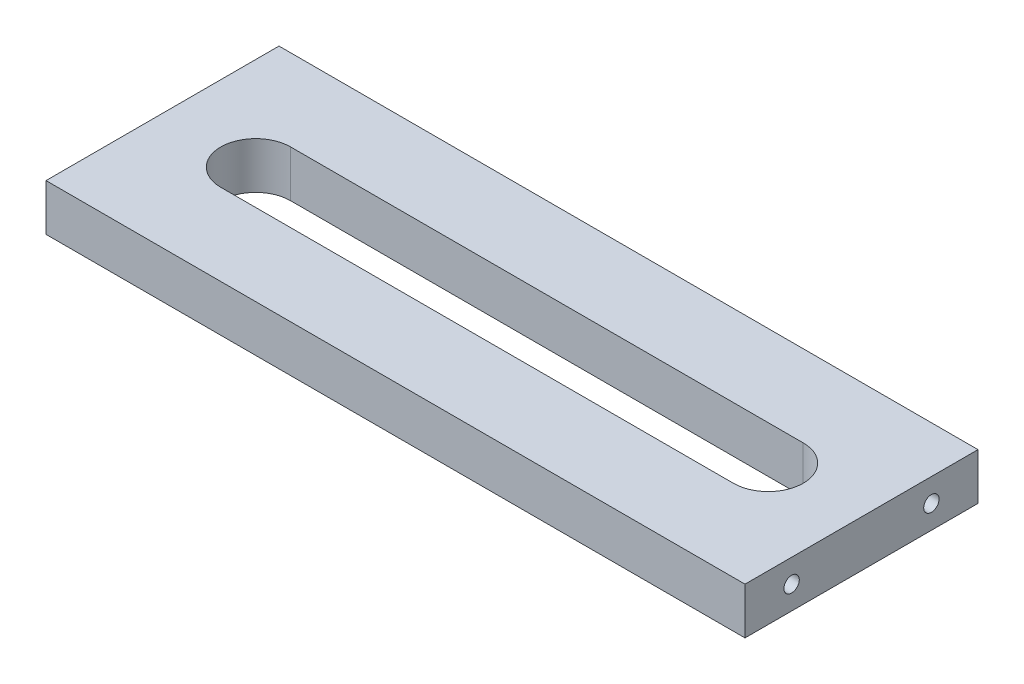
ISO-10303-21;
HEADER;
FILE_DESCRIPTION(('STEP AP214'),'2;1');
FILE_NAME('part.step','',(''),(''),'','','');
FILE_SCHEMA(('AUTOMOTIVE_DESIGN { 1 0 10303 214 1 1 1 1 }'));
ENDSEC;
DATA;
#1=APPLICATION_CONTEXT('core data for automotive mechanical design processes');
#2=APPLICATION_PROTOCOL_DEFINITION('international standard','automotive_design',2000,#1);
#3=PRODUCT_CONTEXT('',#1,'mechanical');
#4=PRODUCT('Part','Part','',(#3));
#5=PRODUCT_RELATED_PRODUCT_CATEGORY('part','',(#4));
#6=PRODUCT_DEFINITION_FORMATION('','',#4);
#7=PRODUCT_DEFINITION_CONTEXT('part definition',#1,'design');
#8=PRODUCT_DEFINITION('design','',#6,#7);
#9=PRODUCT_DEFINITION_SHAPE('','',#8);
#10=(LENGTH_UNIT() NAMED_UNIT(*) SI_UNIT(.MILLI.,.METRE.));
#11=(NAMED_UNIT(*) PLANE_ANGLE_UNIT() SI_UNIT($,.RADIAN.));
#12=(NAMED_UNIT(*) SI_UNIT($,.STERADIAN.) SOLID_ANGLE_UNIT());
#13=UNCERTAINTY_MEASURE_WITH_UNIT(LENGTH_MEASURE(1.E-05),#10,'distance_accuracy_value','');
#14=(GEOMETRIC_REPRESENTATION_CONTEXT(3) GLOBAL_UNCERTAINTY_ASSIGNED_CONTEXT((#13)) GLOBAL_UNIT_ASSIGNED_CONTEXT((#10,
#11,#12)) REPRESENTATION_CONTEXT('',''));
#15=CARTESIAN_POINT('',(0.,0.,0.));
#16=DIRECTION('',(0.,0.,1.));
#17=DIRECTION('',(1.,0.,0.));
#18=AXIS2_PLACEMENT_3D('',#15,#16,#17);
#19=CARTESIAN_POINT('',(75.,10.,25.));
#20=DIRECTION('',(-1.,0.,0.));
#21=DIRECTION('',(0.,0.,1.));
#22=AXIS2_PLACEMENT_3D('',#19,#20,#21);
#23=PLANE('',#22);
#24=CARTESIAN_POINT('',(75.,5.,15.));
#25=DIRECTION('',(1.,0.,0.));
#26=DIRECTION('',(0.,0.,-1.));
#27=AXIS2_PLACEMENT_3D('',#24,#25,#26);
#28=CIRCLE('',#27,1.64999999999999);
#29=CARTESIAN_POINT('',(75.,5.,13.35));
#30=VERTEX_POINT('',#29);
#31=EDGE_CURVE('E118',#30,#30,#28,.T.);
#32=ORIENTED_EDGE('',*,*,#31,.F.);
#33=EDGE_LOOP('',(#32));
#34=FACE_BOUND('',#33,.T.);
#35=CARTESIAN_POINT('',(75.,5.,-15.));
#36=DIRECTION('',(1.,0.,0.));
#37=DIRECTION('',(0.,0.,-1.));
#38=AXIS2_PLACEMENT_3D('',#35,#36,#37);
#39=CIRCLE('',#38,1.64999999999999);
#40=CARTESIAN_POINT('',(75.,5.,-16.65));
#41=VERTEX_POINT('',#40);
#42=EDGE_CURVE('E117',#41,#41,#39,.T.);
#43=ORIENTED_EDGE('',*,*,#42,.F.);
#44=EDGE_LOOP('',(#43));
#45=FACE_BOUND('',#44,.T.);
#46=DIRECTION('',(0.,0.,-1.));
#47=VECTOR('',#46,1.);
#48=CARTESIAN_POINT('',(75.,0.,25.));
#49=LINE('',#48,#47);
#50=CARTESIAN_POINT('',(75.,0.,25.));
#51=VERTEX_POINT('',#50);
#52=CARTESIAN_POINT('',(75.,0.,-25.));
#53=VERTEX_POINT('',#52);
#54=EDGE_CURVE('E163',#51,#53,#49,.T.);
#55=ORIENTED_EDGE('',*,*,#54,.T.);
#56=DIRECTION('',(0.,-1.,0.));
#57=VECTOR('',#56,1.);
#58=CARTESIAN_POINT('',(75.,10.,-25.));
#59=LINE('',#58,#57);
#60=CARTESIAN_POINT('',(75.,10.,-25.));
#61=VERTEX_POINT('',#60);
#62=EDGE_CURVE('E11',#61,#53,#59,.T.);
#63=ORIENTED_EDGE('',*,*,#62,.F.);
#64=DIRECTION('',(0.,0.,-1.));
#65=VECTOR('',#64,1.);
#66=CARTESIAN_POINT('',(75.,10.,25.));
#67=LINE('',#66,#65);
#68=CARTESIAN_POINT('',(75.,10.,25.));
#69=VERTEX_POINT('',#68);
#70=EDGE_CURVE('E169',#69,#61,#67,.T.);
#71=ORIENTED_EDGE('',*,*,#70,.F.);
#72=DIRECTION('',(0.,-1.,0.));
#73=VECTOR('',#72,1.);
#74=CARTESIAN_POINT('',(75.,10.,25.));
#75=LINE('',#74,#73);
#76=EDGE_CURVE('E179',#69,#51,#75,.T.);
#77=ORIENTED_EDGE('',*,*,#76,.T.);
#78=EDGE_LOOP('',(#55,#63,#71,#77));
#79=FACE_BOUND('',#78,.T.);
#80=ADVANCED_FACE('F33',(#34,#45,#79),#23,.F.);
#81=CARTESIAN_POINT('',(-75.,10.,-25.));
#82=DIRECTION('',(0.,0.,1.));
#83=DIRECTION('',(1.,0.,0.));
#84=AXIS2_PLACEMENT_3D('',#81,#82,#83);
#85=PLANE('',#84);
#86=DIRECTION('',(-1.,0.,0.));
#87=VECTOR('',#86,1.);
#88=CARTESIAN_POINT('',(-75.,0.,-25.));
#89=LINE('',#88,#87);
#90=CARTESIAN_POINT('',(-75.,0.,-25.));
#91=VERTEX_POINT('',#90);
#92=EDGE_CURVE('E182',#53,#91,#89,.T.);
#93=ORIENTED_EDGE('',*,*,#92,.T.);
#94=DIRECTION('',(0.,-1.,0.));
#95=VECTOR('',#94,1.);
#96=CARTESIAN_POINT('',(-75.,10.,-25.));
#97=LINE('',#96,#95);
#98=CARTESIAN_POINT('',(-75.,10.,-25.));
#99=VERTEX_POINT('',#98);
#100=EDGE_CURVE('E40',#99,#91,#97,.T.);
#101=ORIENTED_EDGE('',*,*,#100,.F.);
#102=DIRECTION('',(-1.,0.,0.));
#103=VECTOR('',#102,1.);
#104=CARTESIAN_POINT('',(-75.,10.,-25.));
#105=LINE('',#104,#103);
#106=EDGE_CURVE('E172',#61,#99,#105,.T.);
#107=ORIENTED_EDGE('',*,*,#106,.F.);
#108=ORIENTED_EDGE('',*,*,#62,.T.);
#109=EDGE_LOOP('',(#93,#101,#107,#108));
#110=FACE_BOUND('',#109,.T.);
#111=ADVANCED_FACE('F212',(#110),#85,.F.);
#112=CARTESIAN_POINT('',(-75.,10.,25.));
#113=DIRECTION('',(1.,0.,0.));
#114=DIRECTION('',(0.,0.,-1.));
#115=AXIS2_PLACEMENT_3D('',#112,#113,#114);
#116=PLANE('',#115);
#117=CARTESIAN_POINT('',(-75.,5.,-15.));
#118=DIRECTION('',(-1.,0.,0.));
#119=DIRECTION('',(0.,0.,1.));
#120=AXIS2_PLACEMENT_3D('',#117,#118,#119);
#121=CIRCLE('',#120,1.64999999999999);
#122=CARTESIAN_POINT('',(-75.,5.,-13.35));
#123=VERTEX_POINT('',#122);
#124=EDGE_CURVE('E128',#123,#123,#121,.T.);
#125=ORIENTED_EDGE('',*,*,#124,.F.);
#126=EDGE_LOOP('',(#125));
#127=FACE_BOUND('',#126,.T.);
#128=CARTESIAN_POINT('',(-75.,5.,15.));
#129=DIRECTION('',(-1.,0.,0.));
#130=DIRECTION('',(0.,0.,1.));
#131=AXIS2_PLACEMENT_3D('',#128,#129,#130);
#132=CIRCLE('',#131,1.64999999999999);
#133=CARTESIAN_POINT('',(-75.,5.,16.65));
#134=VERTEX_POINT('',#133);
#135=EDGE_CURVE('E134',#134,#134,#132,.T.);
#136=ORIENTED_EDGE('',*,*,#135,.F.);
#137=EDGE_LOOP('',(#136));
#138=FACE_BOUND('',#137,.T.);
#139=DIRECTION('',(0.,0.,1.));
#140=VECTOR('',#139,1.);
#141=CARTESIAN_POINT('',(-75.,0.,25.));
#142=LINE('',#141,#140);
#143=CARTESIAN_POINT('',(-75.,0.,25.));
#144=VERTEX_POINT('',#143);
#145=EDGE_CURVE('E184',#91,#144,#142,.T.);
#146=ORIENTED_EDGE('',*,*,#145,.T.);
#147=DIRECTION('',(0.,-1.,0.));
#148=VECTOR('',#147,1.);
#149=CARTESIAN_POINT('',(-75.,10.,25.));
#150=LINE('',#149,#148);
#151=CARTESIAN_POINT('',(-75.,10.,25.));
#152=VERTEX_POINT('',#151);
#153=EDGE_CURVE('E189',#152,#144,#150,.T.);
#154=ORIENTED_EDGE('',*,*,#153,.F.);
#155=DIRECTION('',(0.,0.,1.));
#156=VECTOR('',#155,1.);
#157=CARTESIAN_POINT('',(-75.,10.,25.));
#158=LINE('',#157,#156);
#159=EDGE_CURVE('E175',#99,#152,#158,.T.);
#160=ORIENTED_EDGE('',*,*,#159,.F.);
#161=ORIENTED_EDGE('',*,*,#100,.T.);
#162=EDGE_LOOP('',(#146,#154,#160,#161));
#163=FACE_BOUND('',#162,.T.);
#164=ADVANCED_FACE('F196',(#127,#138,#163),#116,.F.);
#165=CARTESIAN_POINT('',(-75.,10.,25.));
#166=DIRECTION('',(0.,0.,-1.));
#167=DIRECTION('',(-1.,0.,0.));
#168=AXIS2_PLACEMENT_3D('',#165,#166,#167);
#169=PLANE('',#168);
#170=DIRECTION('',(1.,0.,0.));
#171=VECTOR('',#170,1.);
#172=CARTESIAN_POINT('',(-75.,0.,25.));
#173=LINE('',#172,#171);
#174=EDGE_CURVE('E173',#144,#51,#173,.T.);
#175=ORIENTED_EDGE('',*,*,#174,.T.);
#176=ORIENTED_EDGE('',*,*,#76,.F.);
#177=DIRECTION('',(1.,0.,0.));
#178=VECTOR('',#177,1.);
#179=CARTESIAN_POINT('',(-75.,10.,25.));
#180=LINE('',#179,#178);
#181=EDGE_CURVE('E177',#152,#69,#180,.T.);
#182=ORIENTED_EDGE('',*,*,#181,.F.);
#183=ORIENTED_EDGE('',*,*,#153,.T.);
#184=EDGE_LOOP('',(#175,#176,#182,#183));
#185=FACE_BOUND('',#184,.T.);
#186=ADVANCED_FACE('F205',(#185),#169,.F.);
#187=CARTESIAN_POINT('',(0.,10.,0.));
#188=DIRECTION('',(0.,-1.,0.));
#189=DIRECTION('',(0.,0.,-1.));
#190=AXIS2_PLACEMENT_3D('',#187,#188,#189);
#191=PLANE('',#190);
#192=DIRECTION('',(1.,0.,0.));
#193=VECTOR('',#192,1.);
#194=CARTESIAN_POINT('',(-55.,10.,7.5));
#195=LINE('',#194,#193);
#196=CARTESIAN_POINT('',(-55.,10.,7.5));
#197=VERTEX_POINT('',#196);
#198=CARTESIAN_POINT('',(55.,10.,7.5));
#199=VERTEX_POINT('',#198);
#200=EDGE_CURVE('E153',#197,#199,#195,.T.);
#201=ORIENTED_EDGE('',*,*,#200,.F.);
#202=CARTESIAN_POINT('',(-55.,10.,0.));
#203=DIRECTION('',(0.,1.,0.));
#204=DIRECTION('',(0.,0.,1.));
#205=AXIS2_PLACEMENT_3D('',#202,#203,#204);
#206=CIRCLE('',#205,7.5);
#207=CARTESIAN_POINT('',(-55.,10.,-7.5));
#208=VERTEX_POINT('',#207);
#209=EDGE_CURVE('E47',#208,#197,#206,.T.);
#210=ORIENTED_EDGE('',*,*,#209,.F.);
#211=DIRECTION('',(-1.,0.,0.));
#212=VECTOR('',#211,1.);
#213=CARTESIAN_POINT('',(-55.,10.,-7.5));
#214=LINE('',#213,#212);
#215=CARTESIAN_POINT('',(55.,10.,-7.5));
#216=VERTEX_POINT('',#215);
#217=EDGE_CURVE('E144',#216,#208,#214,.T.);
#218=ORIENTED_EDGE('',*,*,#217,.F.);
#219=CARTESIAN_POINT('',(55.,10.,0.));
#220=DIRECTION('',(0.,1.,0.));
#221=DIRECTION('',(0.,0.,1.));
#222=AXIS2_PLACEMENT_3D('',#219,#220,#221);
#223=CIRCLE('',#222,7.5);
#224=EDGE_CURVE('E156',#199,#216,#223,.T.);
#225=ORIENTED_EDGE('',*,*,#224,.F.);
#226=EDGE_LOOP('',(#201,#210,#218,#225));
#227=FACE_BOUND('',#226,.T.);
#228=ORIENTED_EDGE('',*,*,#70,.T.);
#229=ORIENTED_EDGE('',*,*,#106,.T.);
#230=ORIENTED_EDGE('',*,*,#159,.T.);
#231=ORIENTED_EDGE('',*,*,#181,.T.);
#232=EDGE_LOOP('',(#228,#229,#230,#231));
#233=FACE_BOUND('',#232,.T.);
#234=ADVANCED_FACE('F211',(#227,#233),#191,.F.);
#235=CARTESIAN_POINT('',(0.,0.,0.));
#236=DIRECTION('',(0.,-1.,0.));
#237=DIRECTION('',(0.,0.,-1.));
#238=AXIS2_PLACEMENT_3D('',#235,#236,#237);
#239=PLANE('',#238);
#240=CARTESIAN_POINT('',(-55.,0.,0.));
#241=DIRECTION('',(0.,1.,0.));
#242=DIRECTION('',(0.,0.,1.));
#243=AXIS2_PLACEMENT_3D('',#240,#241,#242);
#244=CIRCLE('',#243,7.5);
#245=CARTESIAN_POINT('',(-55.,0.,-7.5));
#246=VERTEX_POINT('',#245);
#247=CARTESIAN_POINT('',(-55.,0.,7.5));
#248=VERTEX_POINT('',#247);
#249=EDGE_CURVE('E140',#246,#248,#244,.T.);
#250=ORIENTED_EDGE('',*,*,#249,.T.);
#251=DIRECTION('',(1.,0.,0.));
#252=VECTOR('',#251,1.);
#253=CARTESIAN_POINT('',(-55.,0.,7.5));
#254=LINE('',#253,#252);
#255=CARTESIAN_POINT('',(55.,0.,7.5));
#256=VERTEX_POINT('',#255);
#257=EDGE_CURVE('E143',#248,#256,#254,.T.);
#258=ORIENTED_EDGE('',*,*,#257,.T.);
#259=CARTESIAN_POINT('',(55.,0.,0.));
#260=DIRECTION('',(0.,1.,0.));
#261=DIRECTION('',(0.,0.,1.));
#262=AXIS2_PLACEMENT_3D('',#259,#260,#261);
#263=CIRCLE('',#262,7.5);
#264=CARTESIAN_POINT('',(55.,0.,-7.5));
#265=VERTEX_POINT('',#264);
#266=EDGE_CURVE('E55',#256,#265,#263,.T.);
#267=ORIENTED_EDGE('',*,*,#266,.T.);
#268=DIRECTION('',(-1.,0.,0.));
#269=VECTOR('',#268,1.);
#270=CARTESIAN_POINT('',(-55.,0.,-7.5));
#271=LINE('',#270,#269);
#272=EDGE_CURVE('E148',#265,#246,#271,.T.);
#273=ORIENTED_EDGE('',*,*,#272,.T.);
#274=EDGE_LOOP('',(#250,#258,#267,#273));
#275=FACE_BOUND('',#274,.T.);
#276=ORIENTED_EDGE('',*,*,#54,.F.);
#277=ORIENTED_EDGE('',*,*,#174,.F.);
#278=ORIENTED_EDGE('',*,*,#145,.F.);
#279=ORIENTED_EDGE('',*,*,#92,.F.);
#280=EDGE_LOOP('',(#276,#277,#278,#279));
#281=FACE_BOUND('',#280,.T.);
#282=ADVANCED_FACE('F202',(#275,#281),#239,.T.);
#283=CARTESIAN_POINT('',(-55.,0.,0.));
#284=DIRECTION('',(0.,1.,0.));
#285=DIRECTION('',(0.,0.,1.));
#286=AXIS2_PLACEMENT_3D('',#283,#284,#285);
#287=CYLINDRICAL_SURFACE('',#286,7.5);
#288=ORIENTED_EDGE('',*,*,#209,.T.);
#289=DIRECTION('',(0.,1.,0.));
#290=VECTOR('',#289,1.);
#291=CARTESIAN_POINT('',(-55.,0.,7.5));
#292=LINE('',#291,#290);
#293=EDGE_CURVE('E151',#248,#197,#292,.T.);
#294=ORIENTED_EDGE('',*,*,#293,.F.);
#295=ORIENTED_EDGE('',*,*,#249,.F.);
#296=DIRECTION('',(0.,1.,0.));
#297=VECTOR('',#296,1.);
#298=CARTESIAN_POINT('',(-55.,0.,-7.5));
#299=LINE('',#298,#297);
#300=EDGE_CURVE('E161',#246,#208,#299,.T.);
#301=ORIENTED_EDGE('',*,*,#300,.T.);
#302=EDGE_LOOP('',(#288,#294,#295,#301));
#303=FACE_BOUND('',#302,.T.);
#304=ADVANCED_FACE('F226',(#303),#287,.F.);
#305=CARTESIAN_POINT('',(-55.,0.,-7.5));
#306=DIRECTION('',(0.,0.,-1.));
#307=DIRECTION('',(-1.,0.,0.));
#308=AXIS2_PLACEMENT_3D('',#305,#306,#307);
#309=PLANE('',#308);
#310=ORIENTED_EDGE('',*,*,#217,.T.);
#311=ORIENTED_EDGE('',*,*,#300,.F.);
#312=ORIENTED_EDGE('',*,*,#272,.F.);
#313=DIRECTION('',(0.,1.,0.));
#314=VECTOR('',#313,1.);
#315=CARTESIAN_POINT('',(55.,0.,-7.5));
#316=LINE('',#315,#314);
#317=EDGE_CURVE('E164',#265,#216,#316,.T.);
#318=ORIENTED_EDGE('',*,*,#317,.T.);
#319=EDGE_LOOP('',(#310,#311,#312,#318));
#320=FACE_BOUND('',#319,.T.);
#321=ADVANCED_FACE('F233',(#320),#309,.F.);
#322=CARTESIAN_POINT('',(55.,0.,0.));
#323=DIRECTION('',(0.,1.,0.));
#324=DIRECTION('',(0.,0.,1.));
#325=AXIS2_PLACEMENT_3D('',#322,#323,#324);
#326=CYLINDRICAL_SURFACE('',#325,7.5);
#327=ORIENTED_EDGE('',*,*,#224,.T.);
#328=ORIENTED_EDGE('',*,*,#317,.F.);
#329=ORIENTED_EDGE('',*,*,#266,.F.);
#330=DIRECTION('',(0.,1.,0.));
#331=VECTOR('',#330,1.);
#332=CARTESIAN_POINT('',(55.,0.,7.5));
#333=LINE('',#332,#331);
#334=EDGE_CURVE('E166',#256,#199,#333,.T.);
#335=ORIENTED_EDGE('',*,*,#334,.T.);
#336=EDGE_LOOP('',(#327,#328,#329,#335));
#337=FACE_BOUND('',#336,.T.);
#338=ADVANCED_FACE('F238',(#337),#326,.F.);
#339=CARTESIAN_POINT('',(-55.,0.,7.5));
#340=DIRECTION('',(0.,0.,1.));
#341=DIRECTION('',(1.,0.,0.));
#342=AXIS2_PLACEMENT_3D('',#339,#340,#341);
#343=PLANE('',#342);
#344=ORIENTED_EDGE('',*,*,#200,.T.);
#345=ORIENTED_EDGE('',*,*,#334,.F.);
#346=ORIENTED_EDGE('',*,*,#257,.F.);
#347=ORIENTED_EDGE('',*,*,#293,.T.);
#348=EDGE_LOOP('',(#344,#345,#346,#347));
#349=FACE_BOUND('',#348,.T.);
#350=ADVANCED_FACE('F234',(#349),#343,.F.);
#351=CARTESIAN_POINT('',(-68.,5.,15.));
#352=DIRECTION('',(-1.,0.,0.));
#353=DIRECTION('',(0.,0.,1.));
#354=AXIS2_PLACEMENT_3D('',#351,#352,#353);
#355=CONICAL_SURFACE('',#354,1.64999999999999,1.02974425867665);
#356=CARTESIAN_POINT('',(-67.0085799786045,5.,15.));
#357=VERTEX_POINT('',#356);
#358=VERTEX_LOOP('',#357);
#359=FACE_BOUND('',#358,.T.);
#360=CARTESIAN_POINT('',(-68.,5.,15.));
#361=DIRECTION('',(-1.,0.,0.));
#362=DIRECTION('',(0.,0.,1.));
#363=AXIS2_PLACEMENT_3D('',#360,#361,#362);
#364=CIRCLE('',#363,1.64999999999999);
#365=CARTESIAN_POINT('',(-68.,5.,16.65));
#366=VERTEX_POINT('',#365);
#367=EDGE_CURVE('E137',#366,#366,#364,.T.);
#368=ORIENTED_EDGE('',*,*,#367,.T.);
#369=EDGE_LOOP('',(#368));
#370=FACE_BOUND('',#369,.T.);
#371=ADVANCED_FACE('F237',(#359,#370),#355,.F.);
#372=CARTESIAN_POINT('',(-75.,5.,15.));
#373=DIRECTION('',(-1.,0.,0.));
#374=DIRECTION('',(0.,0.,1.));
#375=AXIS2_PLACEMENT_3D('',#372,#373,#374);
#376=CYLINDRICAL_SURFACE('',#375,1.64999999999999);
#377=ORIENTED_EDGE('',*,*,#367,.F.);
#378=EDGE_LOOP('',(#377));
#379=FACE_BOUND('',#378,.T.);
#380=ORIENTED_EDGE('',*,*,#135,.T.);
#381=EDGE_LOOP('',(#380));
#382=FACE_BOUND('',#381,.T.);
#383=ADVANCED_FACE('F247',(#379,#382),#376,.F.);
#384=CARTESIAN_POINT('',(-68.,5.,-15.));
#385=DIRECTION('',(-1.,0.,0.));
#386=DIRECTION('',(0.,0.,1.));
#387=AXIS2_PLACEMENT_3D('',#384,#385,#386);
#388=CONICAL_SURFACE('',#387,1.64999999999999,1.02974425867665);
#389=CARTESIAN_POINT('',(-67.0085799786045,5.,-15.));
#390=VERTEX_POINT('',#389);
#391=VERTEX_LOOP('',#390);
#392=FACE_BOUND('',#391,.T.);
#393=CARTESIAN_POINT('',(-68.,5.,-15.));
#394=DIRECTION('',(-1.,0.,0.));
#395=DIRECTION('',(0.,0.,1.));
#396=AXIS2_PLACEMENT_3D('',#393,#394,#395);
#397=CIRCLE('',#396,1.64999999999999);
#398=CARTESIAN_POINT('',(-68.,5.,-13.35));
#399=VERTEX_POINT('',#398);
#400=EDGE_CURVE('E131',#399,#399,#397,.T.);
#401=ORIENTED_EDGE('',*,*,#400,.T.);
#402=EDGE_LOOP('',(#401));
#403=FACE_BOUND('',#402,.T.);
#404=ADVANCED_FACE('F251',(#392,#403),#388,.F.);
#405=CARTESIAN_POINT('',(-75.,5.,-15.));
#406=DIRECTION('',(-1.,0.,0.));
#407=DIRECTION('',(0.,0.,1.));
#408=AXIS2_PLACEMENT_3D('',#405,#406,#407);
#409=CYLINDRICAL_SURFACE('',#408,1.64999999999999);
#410=ORIENTED_EDGE('',*,*,#400,.F.);
#411=EDGE_LOOP('',(#410));
#412=FACE_BOUND('',#411,.T.);
#413=ORIENTED_EDGE('',*,*,#124,.T.);
#414=EDGE_LOOP('',(#413));
#415=FACE_BOUND('',#414,.T.);
#416=ADVANCED_FACE('F255',(#412,#415),#409,.F.);
#417=CARTESIAN_POINT('',(68.,5.,-15.));
#418=DIRECTION('',(1.,0.,0.));
#419=DIRECTION('',(0.,0.,-1.));
#420=AXIS2_PLACEMENT_3D('',#417,#418,#419);
#421=CONICAL_SURFACE('',#420,1.64999999999999,1.02974425867664);
#422=CARTESIAN_POINT('',(67.0085799786045,5.,-15.));
#423=VERTEX_POINT('',#422);
#424=VERTEX_LOOP('',#423);
#425=FACE_BOUND('',#424,.T.);
#426=CARTESIAN_POINT('',(68.,5.,-15.));
#427=DIRECTION('',(1.,0.,0.));
#428=DIRECTION('',(0.,0.,-1.));
#429=AXIS2_PLACEMENT_3D('',#426,#427,#428);
#430=CIRCLE('',#429,1.64999999999999);
#431=CARTESIAN_POINT('',(68.,5.,-16.65));
#432=VERTEX_POINT('',#431);
#433=EDGE_CURVE('E121',#432,#432,#430,.T.);
#434=ORIENTED_EDGE('',*,*,#433,.T.);
#435=EDGE_LOOP('',(#434));
#436=FACE_BOUND('',#435,.T.);
#437=ADVANCED_FACE('F259',(#425,#436),#421,.F.);
#438=CARTESIAN_POINT('',(75.,5.,-15.));
#439=DIRECTION('',(1.,0.,0.));
#440=DIRECTION('',(0.,0.,-1.));
#441=AXIS2_PLACEMENT_3D('',#438,#439,#440);
#442=CYLINDRICAL_SURFACE('',#441,1.64999999999999);
#443=ORIENTED_EDGE('',*,*,#433,.F.);
#444=EDGE_LOOP('',(#443));
#445=FACE_BOUND('',#444,.T.);
#446=ORIENTED_EDGE('',*,*,#42,.T.);
#447=EDGE_LOOP('',(#446));
#448=FACE_BOUND('',#447,.T.);
#449=ADVANCED_FACE('F111',(#445,#448),#442,.F.);
#450=CARTESIAN_POINT('',(68.,5.,15.));
#451=DIRECTION('',(1.,0.,0.));
#452=DIRECTION('',(0.,0.,-1.));
#453=AXIS2_PLACEMENT_3D('',#450,#451,#452);
#454=CONICAL_SURFACE('',#453,1.64999999999999,1.02974425867664);
#455=CARTESIAN_POINT('',(67.0085799786045,5.,15.));
#456=VERTEX_POINT('',#455);
#457=VERTEX_LOOP('',#456);
#458=FACE_BOUND('',#457,.T.);
#459=CARTESIAN_POINT('',(68.,5.,15.));
#460=DIRECTION('',(1.,0.,0.));
#461=DIRECTION('',(0.,0.,-1.));
#462=AXIS2_PLACEMENT_3D('',#459,#460,#461);
#463=CIRCLE('',#462,1.64999999999999);
#464=CARTESIAN_POINT('',(68.,5.,13.35));
#465=VERTEX_POINT('',#464);
#466=EDGE_CURVE('E115',#465,#465,#463,.T.);
#467=ORIENTED_EDGE('',*,*,#466,.T.);
#468=EDGE_LOOP('',(#467));
#469=FACE_BOUND('',#468,.T.);
#470=ADVANCED_FACE('F107',(#458,#469),#454,.F.);
#471=CARTESIAN_POINT('',(75.,5.,15.));
#472=DIRECTION('',(1.,0.,0.));
#473=DIRECTION('',(0.,0.,-1.));
#474=AXIS2_PLACEMENT_3D('',#471,#472,#473);
#475=CYLINDRICAL_SURFACE('',#474,1.64999999999999);
#476=ORIENTED_EDGE('',*,*,#466,.F.);
#477=EDGE_LOOP('',(#476));
#478=FACE_BOUND('',#477,.T.);
#479=ORIENTED_EDGE('',*,*,#31,.T.);
#480=EDGE_LOOP('',(#479));
#481=FACE_BOUND('',#480,.T.);
#482=ADVANCED_FACE('F110',(#478,#481),#475,.F.);
#483=CLOSED_SHELL('',(#80,#111,#164,#186,#234,#282,#304,#321,#338,#350,#371,#383,#404,#416,#437,
#449,#470,#482));
#484=MANIFOLD_SOLID_BREP('B2',#483);
#485=ADVANCED_BREP_SHAPE_REPRESENTATION('',(#18,#484),#14);
#486=SHAPE_DEFINITION_REPRESENTATION(#9,#485);
ENDSEC;
END-ISO-10303-21;
